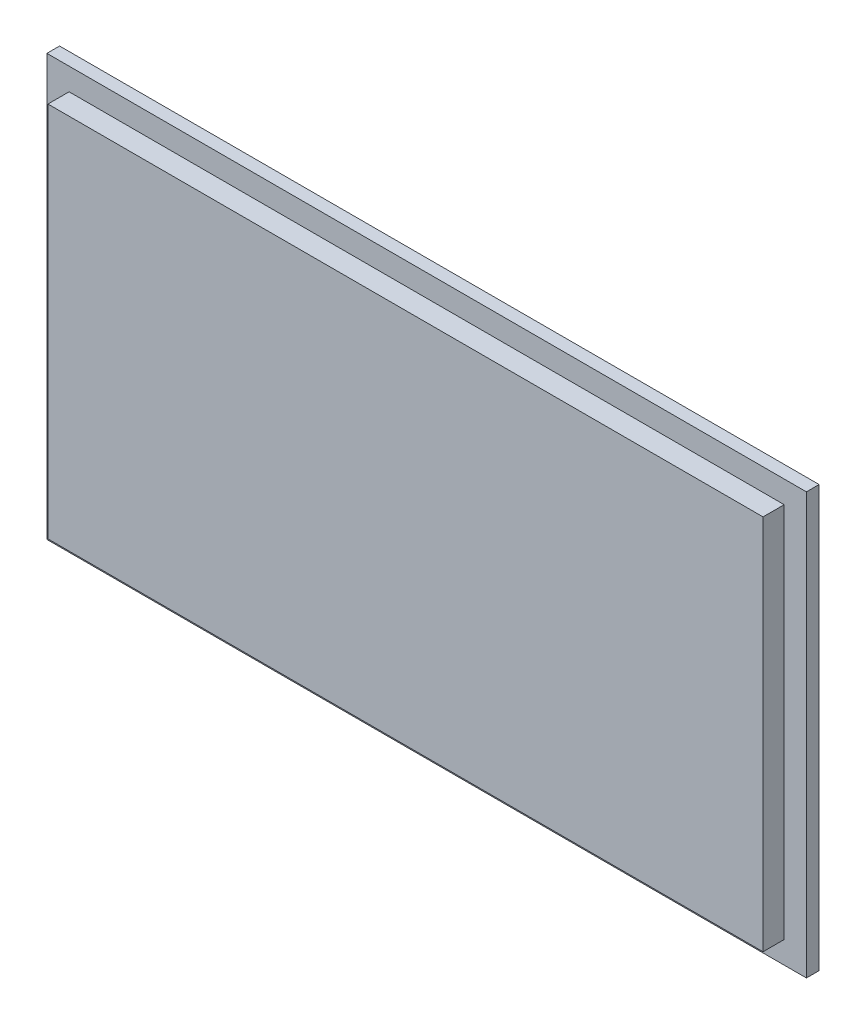
ISO-10303-21;
HEADER;
FILE_DESCRIPTION(('STEP AP214'),'2;1');
FILE_NAME('part.step','',(''),(''),'','','');
FILE_SCHEMA(('AUTOMOTIVE_DESIGN { 1 0 10303 214 1 1 1 1 }'));
ENDSEC;
DATA;
#1=APPLICATION_CONTEXT('core data for automotive mechanical design processes');
#2=APPLICATION_PROTOCOL_DEFINITION('international standard','automotive_design',2000,#1);
#3=PRODUCT_CONTEXT('',#1,'mechanical');
#4=PRODUCT('Part','Part','',(#3));
#5=PRODUCT_RELATED_PRODUCT_CATEGORY('part','',(#4));
#6=PRODUCT_DEFINITION_FORMATION('','',#4);
#7=PRODUCT_DEFINITION_CONTEXT('part definition',#1,'design');
#8=PRODUCT_DEFINITION('design','',#6,#7);
#9=PRODUCT_DEFINITION_SHAPE('','',#8);
#10=(LENGTH_UNIT() NAMED_UNIT(*) SI_UNIT(.MILLI.,.METRE.));
#11=(NAMED_UNIT(*) PLANE_ANGLE_UNIT() SI_UNIT($,.RADIAN.));
#12=(NAMED_UNIT(*) SI_UNIT($,.STERADIAN.) SOLID_ANGLE_UNIT());
#13=UNCERTAINTY_MEASURE_WITH_UNIT(LENGTH_MEASURE(1.E-05),#10,'distance_accuracy_value','');
#14=(GEOMETRIC_REPRESENTATION_CONTEXT(3) GLOBAL_UNCERTAINTY_ASSIGNED_CONTEXT((#13)) GLOBAL_UNIT_ASSIGNED_CONTEXT((#10,
#11,#12)) REPRESENTATION_CONTEXT('',''));
#15=CARTESIAN_POINT('',(0.,0.,0.));
#16=DIRECTION('',(0.,0.,1.));
#17=DIRECTION('',(1.,0.,0.));
#18=AXIS2_PLACEMENT_3D('',#15,#16,#17);
#19=CARTESIAN_POINT('',(0.,99.5,3.));
#20=DIRECTION('',(0.,1.,0.));
#21=DIRECTION('',(0.,0.,1.));
#22=AXIS2_PLACEMENT_3D('',#19,#20,#21);
#23=PLANE('',#22);
#24=DIRECTION('',(1.,0.,0.));
#25=VECTOR('',#24,1.);
#26=CARTESIAN_POINT('',(0.,99.5,0.));
#27=LINE('',#26,#25);
#28=CARTESIAN_POINT('',(0.,99.5,0.));
#29=VERTEX_POINT('',#28);
#30=CARTESIAN_POINT('',(179.5,99.5,0.));
#31=VERTEX_POINT('',#30);
#32=EDGE_CURVE('E118',#29,#31,#27,.T.);
#33=ORIENTED_EDGE('',*,*,#32,.F.);
#34=DIRECTION('',(0.,0.,-1.));
#35=VECTOR('',#34,1.);
#36=CARTESIAN_POINT('',(0.,99.5,3.));
#37=LINE('',#36,#35);
#38=CARTESIAN_POINT('',(0.,99.5,3.));
#39=VERTEX_POINT('',#38);
#40=EDGE_CURVE('E11',#39,#29,#37,.T.);
#41=ORIENTED_EDGE('',*,*,#40,.F.);
#42=DIRECTION('',(1.,0.,0.));
#43=VECTOR('',#42,1.);
#44=CARTESIAN_POINT('',(0.,99.5,3.));
#45=LINE('',#44,#43);
#46=CARTESIAN_POINT('',(179.5,99.5,3.));
#47=VERTEX_POINT('',#46);
#48=EDGE_CURVE('E127',#39,#47,#45,.T.);
#49=ORIENTED_EDGE('',*,*,#48,.T.);
#50=DIRECTION('',(0.,0.,-1.));
#51=VECTOR('',#50,1.);
#52=CARTESIAN_POINT('',(179.5,99.5,3.));
#53=LINE('',#52,#51);
#54=EDGE_CURVE('E36',#47,#31,#53,.T.);
#55=ORIENTED_EDGE('',*,*,#54,.T.);
#56=EDGE_LOOP('',(#33,#41,#49,#55));
#57=FACE_BOUND('',#56,.T.);
#58=ADVANCED_FACE('F33',(#57),#23,.T.);
#59=CARTESIAN_POINT('',(0.,0.,3.));
#60=DIRECTION('',(-1.,0.,0.));
#61=DIRECTION('',(0.,0.,1.));
#62=AXIS2_PLACEMENT_3D('',#59,#60,#61);
#63=PLANE('',#62);
#64=DIRECTION('',(0.,1.,0.));
#65=VECTOR('',#64,1.);
#66=CARTESIAN_POINT('',(0.,0.,0.));
#67=LINE('',#66,#65);
#68=CARTESIAN_POINT('',(0.,0.,0.));
#69=VERTEX_POINT('',#68);
#70=EDGE_CURVE('E131',#69,#29,#67,.T.);
#71=ORIENTED_EDGE('',*,*,#70,.F.);
#72=DIRECTION('',(0.,0.,-1.));
#73=VECTOR('',#72,1.);
#74=CARTESIAN_POINT('',(0.,0.,3.));
#75=LINE('',#74,#73);
#76=CARTESIAN_POINT('',(0.,0.,3.));
#77=VERTEX_POINT('',#76);
#78=EDGE_CURVE('E41',#77,#69,#75,.T.);
#79=ORIENTED_EDGE('',*,*,#78,.F.);
#80=DIRECTION('',(0.,1.,0.));
#81=VECTOR('',#80,1.);
#82=CARTESIAN_POINT('',(0.,0.,3.));
#83=LINE('',#82,#81);
#84=EDGE_CURVE('E135',#77,#39,#83,.T.);
#85=ORIENTED_EDGE('',*,*,#84,.T.);
#86=ORIENTED_EDGE('',*,*,#40,.T.);
#87=EDGE_LOOP('',(#71,#79,#85,#86));
#88=FACE_BOUND('',#87,.T.);
#89=ADVANCED_FACE('F160',(#88),#63,.T.);
#90=CARTESIAN_POINT('',(0.,0.,3.));
#91=DIRECTION('',(0.,1.,0.));
#92=DIRECTION('',(0.,0.,1.));
#93=AXIS2_PLACEMENT_3D('',#90,#91,#92);
#94=PLANE('',#93);
#95=DIRECTION('',(1.,0.,0.));
#96=VECTOR('',#95,1.);
#97=CARTESIAN_POINT('',(0.,0.,0.));
#98=LINE('',#97,#96);
#99=CARTESIAN_POINT('',(179.5,0.,0.));
#100=VERTEX_POINT('',#99);
#101=EDGE_CURVE('E140',#69,#100,#98,.T.);
#102=ORIENTED_EDGE('',*,*,#101,.T.);
#103=DIRECTION('',(0.,0.,-1.));
#104=VECTOR('',#103,1.);
#105=CARTESIAN_POINT('',(179.5,0.,3.));
#106=LINE('',#105,#104);
#107=CARTESIAN_POINT('',(179.5,0.,3.));
#108=VERTEX_POINT('',#107);
#109=EDGE_CURVE('E144',#108,#100,#106,.T.);
#110=ORIENTED_EDGE('',*,*,#109,.F.);
#111=DIRECTION('',(1.,0.,0.));
#112=VECTOR('',#111,1.);
#113=CARTESIAN_POINT('',(0.,0.,3.));
#114=LINE('',#113,#112);
#115=EDGE_CURVE('E133',#77,#108,#114,.T.);
#116=ORIENTED_EDGE('',*,*,#115,.F.);
#117=ORIENTED_EDGE('',*,*,#78,.T.);
#118=EDGE_LOOP('',(#102,#110,#116,#117));
#119=FACE_BOUND('',#118,.T.);
#120=ADVANCED_FACE('F166',(#119),#94,.F.);
#121=CARTESIAN_POINT('',(179.5,0.,3.));
#122=DIRECTION('',(-1.,0.,0.));
#123=DIRECTION('',(0.,0.,1.));
#124=AXIS2_PLACEMENT_3D('',#121,#122,#123);
#125=PLANE('',#124);
#126=DIRECTION('',(0.,1.,0.));
#127=VECTOR('',#126,1.);
#128=CARTESIAN_POINT('',(179.5,0.,0.));
#129=LINE('',#128,#127);
#130=EDGE_CURVE('E121',#100,#31,#129,.T.);
#131=ORIENTED_EDGE('',*,*,#130,.T.);
#132=ORIENTED_EDGE('',*,*,#54,.F.);
#133=DIRECTION('',(0.,1.,0.));
#134=VECTOR('',#133,1.);
#135=CARTESIAN_POINT('',(179.5,0.,3.));
#136=LINE('',#135,#134);
#137=EDGE_CURVE('E130',#108,#47,#136,.T.);
#138=ORIENTED_EDGE('',*,*,#137,.F.);
#139=ORIENTED_EDGE('',*,*,#109,.T.);
#140=EDGE_LOOP('',(#131,#132,#138,#139));
#141=FACE_BOUND('',#140,.T.);
#142=ADVANCED_FACE('F154',(#141),#125,.F.);
#143=CARTESIAN_POINT('',(0.,0.,3.));
#144=DIRECTION('',(0.,0.,1.));
#145=DIRECTION('',(1.,0.,0.));
#146=AXIS2_PLACEMENT_3D('',#143,#144,#145);
#147=PLANE('',#146);
#148=DIRECTION('',(0.,-1.,0.));
#149=VECTOR('',#148,1.);
#150=CARTESIAN_POINT('',(5.25,94.25,3.));
#151=LINE('',#150,#149);
#152=CARTESIAN_POINT('',(5.25,94.25,3.));
#153=VERTEX_POINT('',#152);
#154=CARTESIAN_POINT('',(5.25000000000001,5.25,3.));
#155=VERTEX_POINT('',#154);
#156=EDGE_CURVE('E49',#153,#155,#151,.T.);
#157=ORIENTED_EDGE('',*,*,#156,.F.);
#158=DIRECTION('',(-1.,0.,0.));
#159=VECTOR('',#158,1.);
#160=CARTESIAN_POINT('',(5.25,94.25,3.));
#161=LINE('',#160,#159);
#162=CARTESIAN_POINT('',(174.25,94.25,3.));
#163=VERTEX_POINT('',#162);
#164=EDGE_CURVE('E53',#163,#153,#161,.T.);
#165=ORIENTED_EDGE('',*,*,#164,.F.);
#166=DIRECTION('',(0.,1.,0.));
#167=VECTOR('',#166,1.);
#168=CARTESIAN_POINT('',(174.25,94.25,3.));
#169=LINE('',#168,#167);
#170=CARTESIAN_POINT('',(174.25,5.25,3.));
#171=VERTEX_POINT('',#170);
#172=EDGE_CURVE('E258',#171,#163,#169,.T.);
#173=ORIENTED_EDGE('',*,*,#172,.F.);
#174=DIRECTION('',(1.,0.,0.));
#175=VECTOR('',#174,1.);
#176=CARTESIAN_POINT('',(5.25000000000001,5.25,3.));
#177=LINE('',#176,#175);
#178=EDGE_CURVE('E264',#155,#171,#177,.T.);
#179=ORIENTED_EDGE('',*,*,#178,.F.);
#180=EDGE_LOOP('',(#157,#165,#173,#179));
#181=FACE_BOUND('',#180,.T.);
#182=ORIENTED_EDGE('',*,*,#48,.F.);
#183=ORIENTED_EDGE('',*,*,#84,.F.);
#184=ORIENTED_EDGE('',*,*,#115,.T.);
#185=ORIENTED_EDGE('',*,*,#137,.T.);
#186=EDGE_LOOP('',(#182,#183,#184,#185));
#187=FACE_BOUND('',#186,.T.);
#188=ADVANCED_FACE('F164',(#181,#187),#147,.T.);
#189=CARTESIAN_POINT('',(0.,0.,0.));
#190=DIRECTION('',(0.,0.,1.));
#191=DIRECTION('',(1.,0.,0.));
#192=AXIS2_PLACEMENT_3D('',#189,#190,#191);
#193=PLANE('',#192);
#194=ORIENTED_EDGE('',*,*,#32,.T.);
#195=ORIENTED_EDGE('',*,*,#130,.F.);
#196=ORIENTED_EDGE('',*,*,#101,.F.);
#197=ORIENTED_EDGE('',*,*,#70,.T.);
#198=EDGE_LOOP('',(#194,#195,#196,#197));
#199=FACE_BOUND('',#198,.T.);
#200=ADVANCED_FACE('F157',(#199),#193,.F.);
#201=CARTESIAN_POINT('',(5.25,94.25,8.));
#202=DIRECTION('',(1.,0.,0.));
#203=DIRECTION('',(0.,1.,0.));
#204=AXIS2_PLACEMENT_3D('',#201,#202,#203);
#205=PLANE('',#204);
#206=ORIENTED_EDGE('',*,*,#156,.T.);
#207=DIRECTION('',(0.,0.,-1.));
#208=VECTOR('',#207,1.);
#209=CARTESIAN_POINT('',(5.25000000000001,5.25,8.));
#210=LINE('',#209,#208);
#211=CARTESIAN_POINT('',(5.25000000000001,5.25,8.));
#212=VERTEX_POINT('',#211);
#213=EDGE_CURVE('E101',#212,#155,#210,.T.);
#214=ORIENTED_EDGE('',*,*,#213,.F.);
#215=DIRECTION('',(0.,-1.,0.));
#216=VECTOR('',#215,1.);
#217=CARTESIAN_POINT('',(5.25,94.25,8.));
#218=LINE('',#217,#216);
#219=CARTESIAN_POINT('',(5.25,94.25,8.));
#220=VERTEX_POINT('',#219);
#221=EDGE_CURVE('E107',#220,#212,#218,.T.);
#222=ORIENTED_EDGE('',*,*,#221,.F.);
#223=DIRECTION('',(0.,0.,-1.));
#224=VECTOR('',#223,1.);
#225=CARTESIAN_POINT('',(5.25,94.25,8.));
#226=LINE('',#225,#224);
#227=EDGE_CURVE('E256',#220,#153,#226,.T.);
#228=ORIENTED_EDGE('',*,*,#227,.T.);
#229=EDGE_LOOP('',(#206,#214,#222,#228));
#230=FACE_BOUND('',#229,.T.);
#231=ADVANCED_FACE('F117',(#230),#205,.F.);
#232=CARTESIAN_POINT('',(5.25000000000001,5.25,8.));
#233=DIRECTION('',(0.,1.,0.));
#234=DIRECTION('',(0.,0.,1.));
#235=AXIS2_PLACEMENT_3D('',#232,#233,#234);
#236=PLANE('',#235);
#237=ORIENTED_EDGE('',*,*,#178,.T.);
#238=DIRECTION('',(0.,0.,-1.));
#239=VECTOR('',#238,1.);
#240=CARTESIAN_POINT('',(174.25,5.25,8.));
#241=LINE('',#240,#239);
#242=CARTESIAN_POINT('',(174.25,5.25,8.));
#243=VERTEX_POINT('',#242);
#244=EDGE_CURVE('E103',#243,#171,#241,.T.);
#245=ORIENTED_EDGE('',*,*,#244,.F.);
#246=DIRECTION('',(1.,0.,0.));
#247=VECTOR('',#246,1.);
#248=CARTESIAN_POINT('',(5.25000000000001,5.25,8.));
#249=LINE('',#248,#247);
#250=EDGE_CURVE('E96',#212,#243,#249,.T.);
#251=ORIENTED_EDGE('',*,*,#250,.F.);
#252=ORIENTED_EDGE('',*,*,#213,.T.);
#253=EDGE_LOOP('',(#237,#245,#251,#252));
#254=FACE_BOUND('',#253,.T.);
#255=ADVANCED_FACE('F99',(#254),#236,.F.);
#256=CARTESIAN_POINT('',(174.25,94.25,8.));
#257=DIRECTION('',(-1.,0.,0.));
#258=DIRECTION('',(0.,0.,1.));
#259=AXIS2_PLACEMENT_3D('',#256,#257,#258);
#260=PLANE('',#259);
#261=ORIENTED_EDGE('',*,*,#172,.T.);
#262=DIRECTION('',(0.,0.,-1.));
#263=VECTOR('',#262,1.);
#264=CARTESIAN_POINT('',(174.25,94.25,8.));
#265=LINE('',#264,#263);
#266=CARTESIAN_POINT('',(174.25,94.25,8.));
#267=VERTEX_POINT('',#266);
#268=EDGE_CURVE('E123',#267,#163,#265,.T.);
#269=ORIENTED_EDGE('',*,*,#268,.F.);
#270=DIRECTION('',(0.,1.,0.));
#271=VECTOR('',#270,1.);
#272=CARTESIAN_POINT('',(174.25,94.25,8.));
#273=LINE('',#272,#271);
#274=EDGE_CURVE('E106',#243,#267,#273,.T.);
#275=ORIENTED_EDGE('',*,*,#274,.F.);
#276=ORIENTED_EDGE('',*,*,#244,.T.);
#277=EDGE_LOOP('',(#261,#269,#275,#276));
#278=FACE_BOUND('',#277,.T.);
#279=ADVANCED_FACE('F224',(#278),#260,.F.);
#280=CARTESIAN_POINT('',(5.25,94.25,8.));
#281=DIRECTION('',(0.,-1.,0.));
#282=DIRECTION('',(0.,0.,-1.));
#283=AXIS2_PLACEMENT_3D('',#280,#281,#282);
#284=PLANE('',#283);
#285=ORIENTED_EDGE('',*,*,#164,.T.);
#286=ORIENTED_EDGE('',*,*,#227,.F.);
#287=DIRECTION('',(-1.,0.,0.));
#288=VECTOR('',#287,1.);
#289=CARTESIAN_POINT('',(5.25,94.25,8.));
#290=LINE('',#289,#288);
#291=EDGE_CURVE('E112',#267,#220,#290,.T.);
#292=ORIENTED_EDGE('',*,*,#291,.F.);
#293=ORIENTED_EDGE('',*,*,#268,.T.);
#294=EDGE_LOOP('',(#285,#286,#292,#293));
#295=FACE_BOUND('',#294,.T.);
#296=ADVANCED_FACE('F233',(#295),#284,.F.);
#297=CARTESIAN_POINT('',(0.,0.,8.));
#298=DIRECTION('',(0.,0.,1.));
#299=DIRECTION('',(1.,0.,0.));
#300=AXIS2_PLACEMENT_3D('',#297,#298,#299);
#301=PLANE('',#300);
#302=ORIENTED_EDGE('',*,*,#221,.T.);
#303=ORIENTED_EDGE('',*,*,#250,.T.);
#304=ORIENTED_EDGE('',*,*,#274,.T.);
#305=ORIENTED_EDGE('',*,*,#291,.T.);
#306=EDGE_LOOP('',(#302,#303,#304,#305));
#307=FACE_BOUND('',#306,.T.);
#308=ADVANCED_FACE('F110',(#307),#301,.T.);
#309=CLOSED_SHELL('',(#58,#89,#120,#142,#188,#200,#231,#255,#279,#296,#308));
#310=MANIFOLD_SOLID_BREP('B2',#309);
#311=ADVANCED_BREP_SHAPE_REPRESENTATION('',(#18,#310),#14);
#312=SHAPE_DEFINITION_REPRESENTATION(#9,#311);
ENDSEC;
END-ISO-10303-21;
